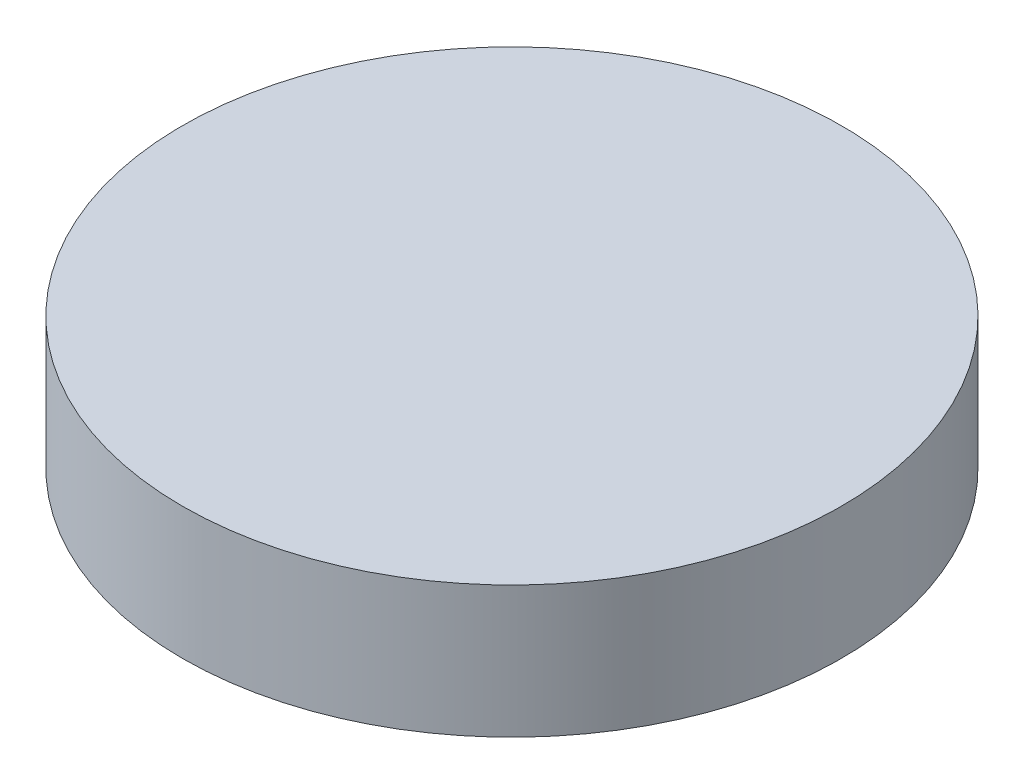
ISO-10303-21;
HEADER;
FILE_DESCRIPTION(('STEP AP214'),'2;1');
FILE_NAME('part.step','',(''),(''),'','','');
FILE_SCHEMA(('AUTOMOTIVE_DESIGN { 1 0 10303 214 1 1 1 1 }'));
ENDSEC;
DATA;
#1=APPLICATION_CONTEXT('core data for automotive mechanical design processes');
#2=APPLICATION_PROTOCOL_DEFINITION('international standard','automotive_design',2000,#1);
#3=PRODUCT_CONTEXT('',#1,'mechanical');
#4=PRODUCT('Part','Part','',(#3));
#5=PRODUCT_RELATED_PRODUCT_CATEGORY('part','',(#4));
#6=PRODUCT_DEFINITION_FORMATION('','',#4);
#7=PRODUCT_DEFINITION_CONTEXT('part definition',#1,'design');
#8=PRODUCT_DEFINITION('design','',#6,#7);
#9=PRODUCT_DEFINITION_SHAPE('','',#8);
#10=(LENGTH_UNIT() NAMED_UNIT(*) SI_UNIT(.MILLI.,.METRE.));
#11=(NAMED_UNIT(*) PLANE_ANGLE_UNIT() SI_UNIT($,.RADIAN.));
#12=(NAMED_UNIT(*) SI_UNIT($,.STERADIAN.) SOLID_ANGLE_UNIT());
#13=UNCERTAINTY_MEASURE_WITH_UNIT(LENGTH_MEASURE(1.E-05),#10,'distance_accuracy_value','');
#14=(GEOMETRIC_REPRESENTATION_CONTEXT(3) GLOBAL_UNCERTAINTY_ASSIGNED_CONTEXT((#13)) GLOBAL_UNIT_ASSIGNED_CONTEXT((#10,
#11,#12)) REPRESENTATION_CONTEXT('',''));
#15=CARTESIAN_POINT('',(0.,0.,0.));
#16=DIRECTION('',(0.,0.,1.));
#17=DIRECTION('',(1.,0.,0.));
#18=AXIS2_PLACEMENT_3D('',#15,#16,#17);
#19=CARTESIAN_POINT('',(0.,5.,0.));
#20=DIRECTION('',(0.,-1.,0.));
#21=DIRECTION('',(0.,0.,-1.));
#22=AXIS2_PLACEMENT_3D('',#19,#20,#21);
#23=CYLINDRICAL_SURFACE('',#22,12.5);
#24=CARTESIAN_POINT('',(0.,5.,0.));
#25=DIRECTION('',(0.,1.,0.));
#26=DIRECTION('',(0.,0.,1.));
#27=AXIS2_PLACEMENT_3D('',#24,#25,#26);
#28=CIRCLE('',#27,12.5);
#29=CARTESIAN_POINT('',(0.,5.,12.5));
#30=VERTEX_POINT('',#29);
#31=EDGE_CURVE('E10',#30,#30,#28,.T.);
#32=ORIENTED_EDGE('',*,*,#31,.F.);
#33=EDGE_LOOP('',(#32));
#34=FACE_BOUND('',#33,.T.);
#35=CARTESIAN_POINT('',(0.,0.,0.));
#36=DIRECTION('',(0.,1.,0.));
#37=DIRECTION('',(0.,0.,1.));
#38=AXIS2_PLACEMENT_3D('',#35,#36,#37);
#39=CIRCLE('',#38,12.5);
#40=CARTESIAN_POINT('',(0.,0.,12.5));
#41=VERTEX_POINT('',#40);
#42=EDGE_CURVE('E34',#41,#41,#39,.T.);
#43=ORIENTED_EDGE('',*,*,#42,.T.);
#44=EDGE_LOOP('',(#43));
#45=FACE_BOUND('',#44,.T.);
#46=ADVANCED_FACE('F31',(#34,#45),#23,.T.);
#47=CARTESIAN_POINT('',(0.,5.,0.));
#48=DIRECTION('',(0.,1.,0.));
#49=DIRECTION('',(0.,0.,1.));
#50=AXIS2_PLACEMENT_3D('',#47,#48,#49);
#51=PLANE('',#50);
#52=ORIENTED_EDGE('',*,*,#31,.T.);
#53=EDGE_LOOP('',(#52));
#54=FACE_BOUND('',#53,.T.);
#55=ADVANCED_FACE('F46',(#54),#51,.T.);
#56=CARTESIAN_POINT('',(0.,0.,0.));
#57=DIRECTION('',(0.,1.,0.));
#58=DIRECTION('',(0.,0.,1.));
#59=AXIS2_PLACEMENT_3D('',#56,#57,#58);
#60=PLANE('',#59);
#61=ORIENTED_EDGE('',*,*,#42,.F.);
#62=EDGE_LOOP('',(#61));
#63=FACE_BOUND('',#62,.T.);
#64=ADVANCED_FACE('F44',(#63),#60,.F.);
#65=CLOSED_SHELL('',(#46,#55,#64));
#66=MANIFOLD_SOLID_BREP('B2',#65);
#67=ADVANCED_BREP_SHAPE_REPRESENTATION('',(#18,#66),#14);
#68=SHAPE_DEFINITION_REPRESENTATION(#9,#67);
ENDSEC;
END-ISO-10303-21;
